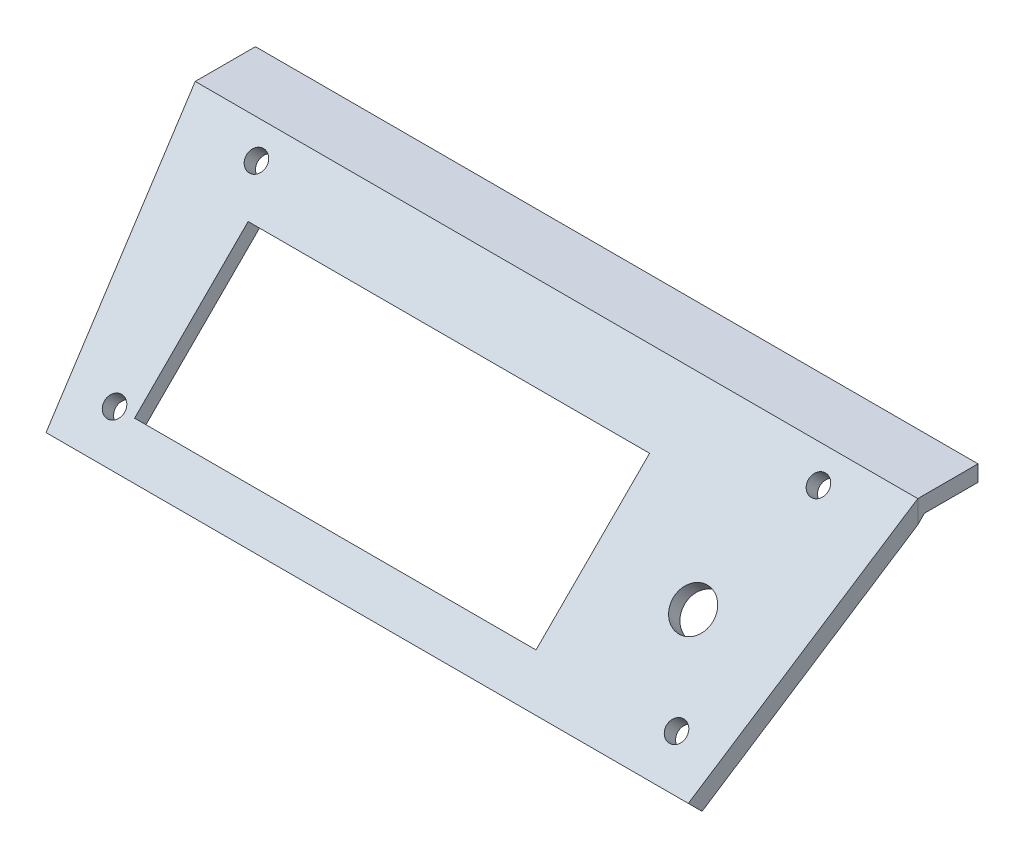
ISO-10303-21;
HEADER;
FILE_DESCRIPTION(('STEP AP214'),'2;1');
FILE_NAME('part.step','',(''),(''),'','','');
FILE_SCHEMA(('AUTOMOTIVE_DESIGN { 1 0 10303 214 1 1 1 1 }'));
ENDSEC;
DATA;
#1=APPLICATION_CONTEXT('core data for automotive mechanical design processes');
#2=APPLICATION_PROTOCOL_DEFINITION('international standard','automotive_design',2000,#1);
#3=PRODUCT_CONTEXT('',#1,'mechanical');
#4=PRODUCT('Part','Part','',(#3));
#5=PRODUCT_RELATED_PRODUCT_CATEGORY('part','',(#4));
#6=PRODUCT_DEFINITION_FORMATION('','',#4);
#7=PRODUCT_DEFINITION_CONTEXT('part definition',#1,'design');
#8=PRODUCT_DEFINITION('design','',#6,#7);
#9=PRODUCT_DEFINITION_SHAPE('','',#8);
#10=(LENGTH_UNIT() NAMED_UNIT(*) SI_UNIT(.MILLI.,.METRE.));
#11=(NAMED_UNIT(*) PLANE_ANGLE_UNIT() SI_UNIT($,.RADIAN.));
#12=(NAMED_UNIT(*) SI_UNIT($,.STERADIAN.) SOLID_ANGLE_UNIT());
#13=UNCERTAINTY_MEASURE_WITH_UNIT(LENGTH_MEASURE(1.E-05),#10,'distance_accuracy_value','');
#14=(GEOMETRIC_REPRESENTATION_CONTEXT(3) GLOBAL_UNCERTAINTY_ASSIGNED_CONTEXT((#13)) GLOBAL_UNIT_ASSIGNED_CONTEXT((#10,
#11,#12)) REPRESENTATION_CONTEXT('',''));
#15=CARTESIAN_POINT('',(0.,0.,0.));
#16=DIRECTION('',(0.,0.,1.));
#17=DIRECTION('',(1.,0.,0.));
#18=AXIS2_PLACEMENT_3D('',#15,#16,#17);
#19=CARTESIAN_POINT('',(90.,0.,59.3431457505075));
#20=DIRECTION('',(0.,0.707106781186546,0.707106781186549));
#21=DIRECTION('',(0.,-0.707106781186549,0.707106781186546));
#22=AXIS2_PLACEMENT_3D('',#19,#20,#21);
#23=PLANE('',#22);
#24=CARTESIAN_POINT('',(-70.,7.0710678118655,52.272077938642));
#25=DIRECTION('',(0.,0.707106781186546,0.707106781186549));
#26=DIRECTION('',(0.,-0.707106781186549,0.707106781186546));
#27=AXIS2_PLACEMENT_3D('',#24,#25,#26);
#28=CIRCLE('',#27,2.50000000000001);
#29=CARTESIAN_POINT('',(-70.,5.30330085889912,54.0398448916084));
#30=VERTEX_POINT('',#29);
#31=EDGE_CURVE('E399',#30,#30,#28,.F.);
#32=ORIENTED_EDGE('',*,*,#31,.F.);
#33=EDGE_LOOP('',(#32));
#34=FACE_BOUND('',#33,.T.);
#35=CARTESIAN_POINT('',(70.,42.426406871193,16.9167388793147));
#36=DIRECTION('',(0.,0.707106781186546,0.707106781186549));
#37=DIRECTION('',(0.,-0.707106781186549,0.707106781186546));
#38=AXIS2_PLACEMENT_3D('',#35,#36,#37);
#39=CIRCLE('',#38,2.5);
#40=CARTESIAN_POINT('',(70.,40.6586399182266,18.6845058322811));
#41=VERTEX_POINT('',#40);
#42=EDGE_CURVE('E408',#41,#41,#39,.T.);
#43=ORIENTED_EDGE('',*,*,#42,.T.);
#44=EDGE_LOOP('',(#43));
#45=FACE_BOUND('',#44,.T.);
#46=CARTESIAN_POINT('',(70.,7.0710678118655,52.272077938642));
#47=DIRECTION('',(0.,0.707106781186546,0.707106781186549));
#48=DIRECTION('',(0.,-0.707106781186549,0.707106781186546));
#49=AXIS2_PLACEMENT_3D('',#46,#47,#48);
#50=CIRCLE('',#49,2.50000000000001);
#51=CARTESIAN_POINT('',(70.,5.30330085889912,54.0398448916084));
#52=VERTEX_POINT('',#51);
#53=EDGE_CURVE('E414',#52,#52,#50,.T.);
#54=ORIENTED_EDGE('',*,*,#53,.T.);
#55=EDGE_LOOP('',(#54));
#56=FACE_BOUND('',#55,.T.);
#57=CARTESIAN_POINT('',(60.,21.2132034355965,38.1299423149111));
#58=DIRECTION('',(0.,0.707106781186546,0.707106781186549));
#59=DIRECTION('',(0.,-0.707106781186549,0.707106781186546));
#60=AXIS2_PLACEMENT_3D('',#57,#58,#59);
#61=CIRCLE('',#60,5.00000000000001);
#62=CARTESIAN_POINT('',(60.,17.6776695296637,41.6654762208438));
#63=VERTEX_POINT('',#62);
#64=EDGE_CURVE('E420',#63,#63,#61,.T.);
#65=ORIENTED_EDGE('',*,*,#64,.T.);
#66=EDGE_LOOP('',(#65));
#67=FACE_BOUND('',#66,.T.);
#68=DIRECTION('',(-1.,0.,0.));
#69=VECTOR('',#68,1.);
#70=CARTESIAN_POINT('',(90.,35.3553390593275,23.9878066911801));
#71=LINE('',#70,#69);
#72=CARTESIAN_POINT('',(35.,35.3553390593275,23.9878066911801));
#73=VERTEX_POINT('',#72);
#74=CARTESIAN_POINT('',(-65.,35.3553390593275,23.9878066911802));
#75=VERTEX_POINT('',#74);
#76=EDGE_CURVE('E145',#73,#75,#71,.T.);
#77=ORIENTED_EDGE('',*,*,#76,.T.);
#78=DIRECTION('',(0.,-0.707106781186549,0.707106781186546));
#79=VECTOR('',#78,1.);
#80=CARTESIAN_POINT('',(-65.,0.,59.3431457505075));
#81=LINE('',#80,#79);
#82=CARTESIAN_POINT('',(-65.,7.07106781186549,52.272077938642));
#83=VERTEX_POINT('',#82);
#84=EDGE_CURVE('E148',#75,#83,#81,.T.);
#85=ORIENTED_EDGE('',*,*,#84,.T.);
#86=DIRECTION('',(1.,0.,0.));
#87=VECTOR('',#86,1.);
#88=CARTESIAN_POINT('',(90.,7.07106781186551,52.272077938642));
#89=LINE('',#88,#87);
#90=CARTESIAN_POINT('',(35.,7.0710678118655,52.272077938642));
#91=VERTEX_POINT('',#90);
#92=EDGE_CURVE('E140',#83,#91,#89,.T.);
#93=ORIENTED_EDGE('',*,*,#92,.T.);
#94=DIRECTION('',(0.,0.707106781186549,-0.707106781186546));
#95=VECTOR('',#94,1.);
#96=CARTESIAN_POINT('',(35.,0.,59.3431457505075));
#97=LINE('',#96,#95);
#98=EDGE_CURVE('E120',#91,#73,#97,.T.);
#99=ORIENTED_EDGE('',*,*,#98,.T.);
#100=EDGE_LOOP('',(#77,#85,#93,#99));
#101=FACE_BOUND('',#100,.T.);
#102=DIRECTION('',(0.148244738794834,-0.699293749943347,0.699293749943344));
#103=VECTOR('',#102,1.);
#104=CARTESIAN_POINT('',(-76.8504215172653,-17.6854842172112,77.0286299677186));
#105=LINE('',#104,#103);
#106=CARTESIAN_POINT('',(-90.,44.3431457505076,15.));
#107=VERTEX_POINT('',#106);
#108=CARTESIAN_POINT('',(-80.5996041582556,0.,59.3431457505075));
#109=VERTEX_POINT('',#108);
#110=EDGE_CURVE('E155',#107,#109,#105,.T.);
#111=ORIENTED_EDGE('',*,*,#110,.F.);
#112=DIRECTION('',(0.,0.707106781186549,-0.707106781186546));
#113=VECTOR('',#112,1.);
#114=CARTESIAN_POINT('',(-90.,0.,59.3431457505075));
#115=LINE('',#114,#113);
#116=CARTESIAN_POINT('',(-90.,46.,13.3431457505077));
#117=VERTEX_POINT('',#116);
#118=EDGE_CURVE('E163',#107,#117,#115,.T.);
#119=ORIENTED_EDGE('',*,*,#118,.T.);
#120=DIRECTION('',(-1.,0.,0.));
#121=VECTOR('',#120,1.);
#122=CARTESIAN_POINT('',(90.,46.,13.3431457505077));
#123=LINE('',#122,#121);
#124=CARTESIAN_POINT('',(90.,46.,13.3431457505077));
#125=VERTEX_POINT('',#124);
#126=EDGE_CURVE('E193',#125,#117,#123,.T.);
#127=ORIENTED_EDGE('',*,*,#126,.F.);
#128=DIRECTION('',(0.,0.707106781186549,-0.707106781186546));
#129=VECTOR('',#128,1.);
#130=CARTESIAN_POINT('',(90.,0.,59.3431457505075));
#131=LINE('',#130,#129);
#132=CARTESIAN_POINT('',(90.,44.3431457505077,15.));
#133=VERTEX_POINT('',#132);
#134=EDGE_CURVE('E164',#133,#125,#131,.T.);
#135=ORIENTED_EDGE('',*,*,#134,.F.);
#136=DIRECTION('',(0.148244738794834,0.699293749943347,-0.699293749943344));
#137=VECTOR('',#136,1.);
#138=CARTESIAN_POINT('',(80.806191981728,0.974507257006798,58.3686384935007));
#139=LINE('',#138,#137);
#140=CARTESIAN_POINT('',(80.5996041582557,0.,59.3431457505075));
#141=VERTEX_POINT('',#140);
#142=EDGE_CURVE('E161',#141,#133,#139,.T.);
#143=ORIENTED_EDGE('',*,*,#142,.F.);
#144=DIRECTION('',(-1.,0.,0.));
#145=VECTOR('',#144,1.);
#146=CARTESIAN_POINT('',(90.,0.,59.3431457505075));
#147=LINE('',#146,#145);
#148=EDGE_CURVE('E196',#141,#109,#147,.T.);
#149=ORIENTED_EDGE('',*,*,#148,.T.);
#150=EDGE_LOOP('',(#111,#119,#127,#135,#143,#149));
#151=FACE_BOUND('',#150,.T.);
#152=CARTESIAN_POINT('',(-70.,42.426406871193,16.9167388793147));
#153=DIRECTION('',(0.,0.707106781186546,0.707106781186549));
#154=DIRECTION('',(0.,-0.707106781186549,0.707106781186546));
#155=AXIS2_PLACEMENT_3D('',#152,#153,#154);
#156=CIRCLE('',#155,2.5);
#157=CARTESIAN_POINT('',(-70.,40.6586399182266,18.6845058322811));
#158=VERTEX_POINT('',#157);
#159=EDGE_CURVE('E395',#158,#158,#156,.F.);
#160=ORIENTED_EDGE('',*,*,#159,.F.);
#161=EDGE_LOOP('',(#160));
#162=FACE_BOUND('',#161,.T.);
#163=ADVANCED_FACE('F32',(#34,#45,#56,#67,#101,#151,#162),#23,.F.);
#164=CARTESIAN_POINT('',(90.,50.,15.));
#165=DIRECTION('',(0.,-0.707106781186546,-0.707106781186548));
#166=DIRECTION('',(0.,0.707106781186549,-0.707106781186547));
#167=AXIS2_PLACEMENT_3D('',#164,#165,#166);
#168=PLANE('',#167);
#169=CARTESIAN_POINT('',(-70.,9.8994949366117,55.1005050633882));
#170=DIRECTION('',(0.,-0.707106781186547,-0.707106781186548));
#171=DIRECTION('',(0.,-0.707106781186548,0.707106781186547));
#172=AXIS2_PLACEMENT_3D('',#169,#170,#171);
#173=CIRCLE('',#172,2.50000000000001);
#174=CARTESIAN_POINT('',(-70.,8.13172798364532,56.8682720163546));
#175=VERTEX_POINT('',#174);
#176=EDGE_CURVE('E396',#175,#175,#173,.T.);
#177=ORIENTED_EDGE('',*,*,#176,.T.);
#178=EDGE_LOOP('',(#177));
#179=FACE_BOUND('',#178,.T.);
#180=CARTESIAN_POINT('',(70.,45.2548339959391,19.7451660040609));
#181=DIRECTION('',(0.,0.707106781186547,0.707106781186548));
#182=DIRECTION('',(0.,-0.707106781186548,0.707106781186547));
#183=AXIS2_PLACEMENT_3D('',#180,#181,#182);
#184=CIRCLE('',#183,2.5);
#185=CARTESIAN_POINT('',(70.,43.4870670429728,21.5129329570272));
#186=VERTEX_POINT('',#185);
#187=EDGE_CURVE('E405',#186,#186,#184,.T.);
#188=ORIENTED_EDGE('',*,*,#187,.F.);
#189=EDGE_LOOP('',(#188));
#190=FACE_BOUND('',#189,.T.);
#191=CARTESIAN_POINT('',(70.,9.8994949366117,55.1005050633882));
#192=DIRECTION('',(0.,0.707106781186547,0.707106781186548));
#193=DIRECTION('',(0.,-0.707106781186548,0.707106781186547));
#194=AXIS2_PLACEMENT_3D('',#191,#192,#193);
#195=CIRCLE('',#194,2.50000000000001);
#196=CARTESIAN_POINT('',(70.,8.13172798364532,56.8682720163546));
#197=VERTEX_POINT('',#196);
#198=EDGE_CURVE('E411',#197,#197,#195,.T.);
#199=ORIENTED_EDGE('',*,*,#198,.F.);
#200=EDGE_LOOP('',(#199));
#201=FACE_BOUND('',#200,.T.);
#202=CARTESIAN_POINT('',(60.,24.0416305603427,40.9583694396573));
#203=DIRECTION('',(0.,0.707106781186547,0.707106781186548));
#204=DIRECTION('',(0.,-0.707106781186548,0.707106781186547));
#205=AXIS2_PLACEMENT_3D('',#202,#203,#204);
#206=CIRCLE('',#205,5.00000000000001);
#207=CARTESIAN_POINT('',(60.,20.5060966544099,44.49390334559));
#208=VERTEX_POINT('',#207);
#209=EDGE_CURVE('E417',#208,#208,#206,.T.);
#210=ORIENTED_EDGE('',*,*,#209,.F.);
#211=EDGE_LOOP('',(#210));
#212=FACE_BOUND('',#211,.T.);
#213=DIRECTION('',(1.,0.,0.));
#214=VECTOR('',#213,1.);
#215=CARTESIAN_POINT('',(35.,9.89949493661171,55.1005050633882));
#216=LINE('',#215,#214);
#217=CARTESIAN_POINT('',(-65.,9.89949493661168,55.1005050633882));
#218=VERTEX_POINT('',#217);
#219=CARTESIAN_POINT('',(35.,9.89949493661171,55.1005050633882));
#220=VERTEX_POINT('',#219);
#221=EDGE_CURVE('E126',#218,#220,#216,.T.);
#222=ORIENTED_EDGE('',*,*,#221,.F.);
#223=DIRECTION('',(0.,-0.707106781186548,0.707106781186547));
#224=VECTOR('',#223,1.);
#225=CARTESIAN_POINT('',(-65.,9.8994949366117,55.1005050633882));
#226=LINE('',#225,#224);
#227=CARTESIAN_POINT('',(-65.,38.1837661840736,26.8162338159264));
#228=VERTEX_POINT('',#227);
#229=EDGE_CURVE('E55',#228,#218,#226,.T.);
#230=ORIENTED_EDGE('',*,*,#229,.F.);
#231=DIRECTION('',(-1.,0.,0.));
#232=VECTOR('',#231,1.);
#233=CARTESIAN_POINT('',(35.,38.1837661840736,26.8162338159263));
#234=LINE('',#233,#232);
#235=CARTESIAN_POINT('',(35.,38.1837661840736,26.8162338159263));
#236=VERTEX_POINT('',#235);
#237=EDGE_CURVE('E133',#236,#228,#234,.T.);
#238=ORIENTED_EDGE('',*,*,#237,.F.);
#239=DIRECTION('',(0.,0.707106781186548,-0.707106781186547));
#240=VECTOR('',#239,1.);
#241=CARTESIAN_POINT('',(35.,9.89949493661171,55.1005050633882));
#242=LINE('',#241,#240);
#243=EDGE_CURVE('E117',#220,#236,#242,.T.);
#244=ORIENTED_EDGE('',*,*,#243,.F.);
#245=EDGE_LOOP('',(#222,#230,#238,#244));
#246=FACE_BOUND('',#245,.T.);
#247=DIRECTION('',(-0.148244738794834,0.699293749943346,-0.699293749943344));
#248=VECTOR('',#247,1.);
#249=CARTESIAN_POINT('',(-86.0442295355373,31.340008525782,33.6599914742179));
#250=LINE('',#249,#248);
#251=CARTESIAN_POINT('',(-80.,2.82842712474614,62.1715728752537));
#252=VERTEX_POINT('',#251);
#253=CARTESIAN_POINT('',(-90.,50.,15.));
#254=VERTEX_POINT('',#253);
#255=EDGE_CURVE('E151',#252,#254,#250,.T.);
#256=ORIENTED_EDGE('',*,*,#255,.F.);
#257=DIRECTION('',(-1.,0.,0.));
#258=VECTOR('',#257,1.);
#259=CARTESIAN_POINT('',(90.,2.82842712474618,62.1715728752537));
#260=LINE('',#259,#258);
#261=CARTESIAN_POINT('',(80.,2.82842712474621,62.1715728752537));
#262=VERTEX_POINT('',#261);
#263=EDGE_CURVE('E174',#262,#252,#260,.T.);
#264=ORIENTED_EDGE('',*,*,#263,.F.);
#265=DIRECTION('',(-0.148244738794834,-0.699293749943346,0.699293749943344));
#266=VECTOR('',#265,1.);
#267=CARTESIAN_POINT('',(90.,50.,15.));
#268=LINE('',#267,#266);
#269=CARTESIAN_POINT('',(90.,50.,15.));
#270=VERTEX_POINT('',#269);
#271=EDGE_CURVE('E157',#270,#262,#268,.T.);
#272=ORIENTED_EDGE('',*,*,#271,.F.);
#273=DIRECTION('',(-1.,0.,0.));
#274=VECTOR('',#273,1.);
#275=CARTESIAN_POINT('',(90.,50.,15.));
#276=LINE('',#275,#274);
#277=EDGE_CURVE('E184',#270,#254,#276,.T.);
#278=ORIENTED_EDGE('',*,*,#277,.T.);
#279=EDGE_LOOP('',(#256,#264,#272,#278));
#280=FACE_BOUND('',#279,.T.);
#281=CARTESIAN_POINT('',(-70.,45.2548339959391,19.7451660040609));
#282=DIRECTION('',(0.,-0.707106781186547,-0.707106781186548));
#283=DIRECTION('',(0.,-0.707106781186548,0.707106781186547));
#284=AXIS2_PLACEMENT_3D('',#281,#282,#283);
#285=CIRCLE('',#284,2.5);
#286=CARTESIAN_POINT('',(-70.,43.4870670429728,21.5129329570272));
#287=VERTEX_POINT('',#286);
#288=EDGE_CURVE('E392',#287,#287,#285,.T.);
#289=ORIENTED_EDGE('',*,*,#288,.T.);
#290=EDGE_LOOP('',(#289));
#291=FACE_BOUND('',#290,.T.);
#292=ADVANCED_FACE('F130',(#179,#190,#201,#212,#246,#280,#291),#168,.F.);
#293=CARTESIAN_POINT('',(90.,2.82842712474618,62.1715728752537));
#294=DIRECTION('',(0.,0.707106781186549,-0.707106781186545));
#295=DIRECTION('',(0.,0.707106781186546,0.70710678118655));
#296=AXIS2_PLACEMENT_3D('',#293,#294,#295);
#297=PLANE('',#296);
#298=DIRECTION('',(0.148244738794834,0.699293749943343,0.699293749943347));
#299=VECTOR('',#298,1.);
#300=CARTESIAN_POINT('',(-76.2639945613407,20.4517524059521,79.7948981564597));
#301=LINE('',#300,#299);
#302=EDGE_CURVE('E153',#109,#252,#301,.T.);
#303=ORIENTED_EDGE('',*,*,#302,.F.);
#304=ORIENTED_EDGE('',*,*,#148,.F.);
#305=DIRECTION('',(0.148244738794834,-0.699293749943343,-0.699293749943347));
#306=VECTOR('',#305,1.);
#307=CARTESIAN_POINT('',(80.2197650258035,1.79176093173407,61.1349066822416));
#308=LINE('',#307,#306);
#309=EDGE_CURVE('E159',#262,#141,#308,.T.);
#310=ORIENTED_EDGE('',*,*,#309,.F.);
#311=ORIENTED_EDGE('',*,*,#263,.T.);
#312=EDGE_LOOP('',(#303,#304,#310,#311));
#313=FACE_BOUND('',#312,.T.);
#314=ADVANCED_FACE('F34',(#313),#297,.F.);
#315=CARTESIAN_POINT('',(-90.,0.,0.));
#316=DIRECTION('',(1.,0.,0.));
#317=DIRECTION('',(0.,0.,-1.));
#318=AXIS2_PLACEMENT_3D('',#315,#316,#317);
#319=PLANE('',#318);
#320=DIRECTION('',(0.,-1.,0.));
#321=VECTOR('',#320,1.);
#322=CARTESIAN_POINT('',(-90.,0.,15.));
#323=LINE('',#322,#321);
#324=EDGE_CURVE('E11',#254,#107,#323,.T.);
#325=ORIENTED_EDGE('',*,*,#324,.F.);
#326=DIRECTION('',(0.,0.,1.));
#327=VECTOR('',#326,1.);
#328=CARTESIAN_POINT('',(-90.,50.,0.));
#329=LINE('',#328,#327);
#330=CARTESIAN_POINT('',(-90.,50.,0.));
#331=VERTEX_POINT('',#330);
#332=EDGE_CURVE('E167',#331,#254,#329,.T.);
#333=ORIENTED_EDGE('',*,*,#332,.F.);
#334=DIRECTION('',(0.,1.,0.));
#335=VECTOR('',#334,1.);
#336=CARTESIAN_POINT('',(-90.,46.,0.));
#337=LINE('',#336,#335);
#338=CARTESIAN_POINT('',(-90.,46.,0.));
#339=VERTEX_POINT('',#338);
#340=EDGE_CURVE('E178',#339,#331,#337,.T.);
#341=ORIENTED_EDGE('',*,*,#340,.F.);
#342=DIRECTION('',(0.,0.,-1.));
#343=VECTOR('',#342,1.);
#344=CARTESIAN_POINT('',(-90.,46.,13.3431457505077));
#345=LINE('',#344,#343);
#346=EDGE_CURVE('E176',#117,#339,#345,.T.);
#347=ORIENTED_EDGE('',*,*,#346,.F.);
#348=ORIENTED_EDGE('',*,*,#118,.F.);
#349=EDGE_LOOP('',(#325,#333,#341,#347,#348));
#350=FACE_BOUND('',#349,.T.);
#351=ADVANCED_FACE('F236',(#350),#319,.F.);
#352=CARTESIAN_POINT('',(90.,0.,0.));
#353=DIRECTION('',(1.,0.,0.));
#354=DIRECTION('',(0.,0.,-1.));
#355=AXIS2_PLACEMENT_3D('',#352,#353,#354);
#356=PLANE('',#355);
#357=DIRECTION('',(0.,0.,1.));
#358=VECTOR('',#357,1.);
#359=CARTESIAN_POINT('',(90.,50.,0.));
#360=LINE('',#359,#358);
#361=CARTESIAN_POINT('',(90.,50.,0.));
#362=VERTEX_POINT('',#361);
#363=EDGE_CURVE('E171',#362,#270,#360,.T.);
#364=ORIENTED_EDGE('',*,*,#363,.T.);
#365=DIRECTION('',(0.,-1.,0.));
#366=VECTOR('',#365,1.);
#367=CARTESIAN_POINT('',(90.,0.,15.));
#368=LINE('',#367,#366);
#369=EDGE_CURVE('E40',#270,#133,#368,.T.);
#370=ORIENTED_EDGE('',*,*,#369,.T.);
#371=ORIENTED_EDGE('',*,*,#134,.T.);
#372=DIRECTION('',(0.,0.,-1.));
#373=VECTOR('',#372,1.);
#374=CARTESIAN_POINT('',(90.,46.,13.3431457505077));
#375=LINE('',#374,#373);
#376=CARTESIAN_POINT('',(90.,46.,0.));
#377=VERTEX_POINT('',#376);
#378=EDGE_CURVE('E166',#125,#377,#375,.T.);
#379=ORIENTED_EDGE('',*,*,#378,.T.);
#380=DIRECTION('',(0.,1.,0.));
#381=VECTOR('',#380,1.);
#382=CARTESIAN_POINT('',(90.,46.,0.));
#383=LINE('',#382,#381);
#384=EDGE_CURVE('E169',#377,#362,#383,.T.);
#385=ORIENTED_EDGE('',*,*,#384,.T.);
#386=EDGE_LOOP('',(#364,#370,#371,#379,#385));
#387=FACE_BOUND('',#386,.T.);
#388=ADVANCED_FACE('F201',(#387),#356,.T.);
#389=CARTESIAN_POINT('',(90.,46.,13.3431457505077));
#390=DIRECTION('',(0.,1.,0.));
#391=DIRECTION('',(0.,0.,1.));
#392=AXIS2_PLACEMENT_3D('',#389,#390,#391);
#393=PLANE('',#392);
#394=ORIENTED_EDGE('',*,*,#346,.T.);
#395=DIRECTION('',(-1.,0.,0.));
#396=VECTOR('',#395,1.);
#397=CARTESIAN_POINT('',(90.,46.,0.));
#398=LINE('',#397,#396);
#399=EDGE_CURVE('E190',#377,#339,#398,.T.);
#400=ORIENTED_EDGE('',*,*,#399,.F.);
#401=ORIENTED_EDGE('',*,*,#378,.F.);
#402=ORIENTED_EDGE('',*,*,#126,.T.);
#403=EDGE_LOOP('',(#394,#400,#401,#402));
#404=FACE_BOUND('',#403,.T.);
#405=ADVANCED_FACE('F217',(#404),#393,.F.);
#406=CARTESIAN_POINT('',(90.,46.,0.));
#407=DIRECTION('',(0.,0.,1.));
#408=DIRECTION('',(1.,0.,0.));
#409=AXIS2_PLACEMENT_3D('',#406,#407,#408);
#410=PLANE('',#409);
#411=ORIENTED_EDGE('',*,*,#340,.T.);
#412=DIRECTION('',(-1.,0.,0.));
#413=VECTOR('',#412,1.);
#414=CARTESIAN_POINT('',(90.,50.,0.));
#415=LINE('',#414,#413);
#416=EDGE_CURVE('E187',#362,#331,#415,.T.);
#417=ORIENTED_EDGE('',*,*,#416,.F.);
#418=ORIENTED_EDGE('',*,*,#384,.F.);
#419=ORIENTED_EDGE('',*,*,#399,.T.);
#420=EDGE_LOOP('',(#411,#417,#418,#419));
#421=FACE_BOUND('',#420,.T.);
#422=ADVANCED_FACE('F221',(#421),#410,.F.);
#423=CARTESIAN_POINT('',(90.,50.,0.));
#424=DIRECTION('',(0.,-1.,0.));
#425=DIRECTION('',(0.,0.,-1.));
#426=AXIS2_PLACEMENT_3D('',#423,#424,#425);
#427=PLANE('',#426);
#428=ORIENTED_EDGE('',*,*,#332,.T.);
#429=ORIENTED_EDGE('',*,*,#277,.F.);
#430=ORIENTED_EDGE('',*,*,#363,.F.);
#431=ORIENTED_EDGE('',*,*,#416,.T.);
#432=EDGE_LOOP('',(#428,#429,#430,#431));
#433=FACE_BOUND('',#432,.T.);
#434=ADVANCED_FACE('F225',(#433),#427,.F.);
#435=CARTESIAN_POINT('',(90.,160.,15.));
#436=DIRECTION('',(0.978259759376829,0.,0.207383324266897));
#437=DIRECTION('',(0.207383324266897,0.,-0.978259759376829));
#438=AXIS2_PLACEMENT_3D('',#435,#436,#437);
#439=PLANE('',#438);
#440=ORIENTED_EDGE('',*,*,#142,.T.);
#441=ORIENTED_EDGE('',*,*,#369,.F.);
#442=ORIENTED_EDGE('',*,*,#271,.T.);
#443=ORIENTED_EDGE('',*,*,#309,.T.);
#444=EDGE_LOOP('',(#440,#441,#442,#443));
#445=FACE_BOUND('',#444,.T.);
#446=ADVANCED_FACE('F230',(#445),#439,.T.);
#447=CARTESIAN_POINT('',(-80.,160.,62.1715728752537));
#448=DIRECTION('',(-0.978259759376829,0.,0.207383324266897));
#449=DIRECTION('',(0.207383324266897,0.,0.978259759376829));
#450=AXIS2_PLACEMENT_3D('',#447,#448,#449);
#451=PLANE('',#450);
#452=ORIENTED_EDGE('',*,*,#110,.T.);
#453=ORIENTED_EDGE('',*,*,#302,.T.);
#454=ORIENTED_EDGE('',*,*,#255,.T.);
#455=ORIENTED_EDGE('',*,*,#324,.T.);
#456=EDGE_LOOP('',(#452,#453,#454,#455));
#457=FACE_BOUND('',#456,.T.);
#458=ADVANCED_FACE('F237',(#457),#451,.T.);
#459=CARTESIAN_POINT('',(-65.,-22.6005050633883,22.6005050633882));
#460=DIRECTION('',(-1.,0.,0.));
#461=DIRECTION('',(0.,0.,1.));
#462=AXIS2_PLACEMENT_3D('',#459,#460,#461);
#463=PLANE('',#462);
#464=DIRECTION('',(0.,0.707106781186547,0.707106781186548));
#465=VECTOR('',#464,1.);
#466=CARTESIAN_POINT('',(-65.,5.68376618407369,-5.68376618407368));
#467=LINE('',#466,#465);
#468=EDGE_CURVE('E138',#75,#228,#467,.T.);
#469=ORIENTED_EDGE('',*,*,#468,.T.);
#470=ORIENTED_EDGE('',*,*,#229,.T.);
#471=DIRECTION('',(0.,0.707106781186547,0.707106781186548));
#472=VECTOR('',#471,1.);
#473=CARTESIAN_POINT('',(-65.,-22.6005050633883,22.6005050633882));
#474=LINE('',#473,#472);
#475=EDGE_CURVE('E123',#83,#218,#474,.T.);
#476=ORIENTED_EDGE('',*,*,#475,.F.);
#477=ORIENTED_EDGE('',*,*,#84,.F.);
#478=EDGE_LOOP('',(#469,#470,#476,#477));
#479=FACE_BOUND('',#478,.T.);
#480=ADVANCED_FACE('F239',(#479),#463,.F.);
#481=CARTESIAN_POINT('',(35.,5.68376618407369,-5.68376618407369));
#482=DIRECTION('',(0.,0.707106781186548,-0.707106781186547));
#483=DIRECTION('',(0.,0.707106781186547,0.707106781186548));
#484=AXIS2_PLACEMENT_3D('',#481,#482,#483);
#485=PLANE('',#484);
#486=DIRECTION('',(0.,0.707106781186547,0.707106781186548));
#487=VECTOR('',#486,1.);
#488=CARTESIAN_POINT('',(35.,5.68376618407369,-5.68376618407369));
#489=LINE('',#488,#487);
#490=EDGE_CURVE('E122',#73,#236,#489,.T.);
#491=ORIENTED_EDGE('',*,*,#490,.T.);
#492=ORIENTED_EDGE('',*,*,#237,.T.);
#493=ORIENTED_EDGE('',*,*,#468,.F.);
#494=ORIENTED_EDGE('',*,*,#76,.F.);
#495=EDGE_LOOP('',(#491,#492,#493,#494));
#496=FACE_BOUND('',#495,.T.);
#497=ADVANCED_FACE('F245',(#496),#485,.F.);
#498=CARTESIAN_POINT('',(35.,-22.6005050633882,22.6005050633882));
#499=DIRECTION('',(1.,0.,0.));
#500=DIRECTION('',(0.,0.,-1.));
#501=AXIS2_PLACEMENT_3D('',#498,#499,#500);
#502=PLANE('',#501);
#503=DIRECTION('',(0.,0.707106781186547,0.707106781186548));
#504=VECTOR('',#503,1.);
#505=CARTESIAN_POINT('',(35.,-22.6005050633882,22.6005050633882));
#506=LINE('',#505,#504);
#507=EDGE_CURVE('E47',#91,#220,#506,.T.);
#508=ORIENTED_EDGE('',*,*,#507,.T.);
#509=ORIENTED_EDGE('',*,*,#243,.T.);
#510=ORIENTED_EDGE('',*,*,#490,.F.);
#511=ORIENTED_EDGE('',*,*,#98,.F.);
#512=EDGE_LOOP('',(#508,#509,#510,#511));
#513=FACE_BOUND('',#512,.T.);
#514=ADVANCED_FACE('F114',(#513),#502,.F.);
#515=CARTESIAN_POINT('',(35.,-22.6005050633882,22.6005050633882));
#516=DIRECTION('',(0.,-0.707106781186548,0.707106781186547));
#517=DIRECTION('',(0.,-0.707106781186547,-0.707106781186548));
#518=AXIS2_PLACEMENT_3D('',#515,#516,#517);
#519=PLANE('',#518);
#520=ORIENTED_EDGE('',*,*,#475,.T.);
#521=ORIENTED_EDGE('',*,*,#221,.T.);
#522=ORIENTED_EDGE('',*,*,#507,.F.);
#523=ORIENTED_EDGE('',*,*,#92,.F.);
#524=EDGE_LOOP('',(#520,#521,#522,#523));
#525=FACE_BOUND('',#524,.T.);
#526=ADVANCED_FACE('F127',(#525),#519,.F.);
#527=CARTESIAN_POINT('',(60.,-8.45836943965728,8.45836943965724));
#528=DIRECTION('',(0.,0.707106781186547,0.707106781186548));
#529=DIRECTION('',(0.,-0.707106781186548,0.707106781186547));
#530=AXIS2_PLACEMENT_3D('',#527,#528,#529);
#531=CYLINDRICAL_SURFACE('',#530,5.00000000000001);
#532=ORIENTED_EDGE('',*,*,#209,.T.);
#533=EDGE_LOOP('',(#532));
#534=FACE_BOUND('',#533,.T.);
#535=ORIENTED_EDGE('',*,*,#64,.F.);
#536=EDGE_LOOP('',(#535));
#537=FACE_BOUND('',#536,.T.);
#538=ADVANCED_FACE('F326',(#534,#537),#531,.F.);
#539=CARTESIAN_POINT('',(70.,-22.6005050633883,22.6005050633882));
#540=DIRECTION('',(0.,0.707106781186547,0.707106781186548));
#541=DIRECTION('',(0.,-0.707106781186548,0.707106781186547));
#542=AXIS2_PLACEMENT_3D('',#539,#540,#541);
#543=CYLINDRICAL_SURFACE('',#542,2.50000000000001);
#544=ORIENTED_EDGE('',*,*,#198,.T.);
#545=EDGE_LOOP('',(#544));
#546=FACE_BOUND('',#545,.T.);
#547=ORIENTED_EDGE('',*,*,#53,.F.);
#548=EDGE_LOOP('',(#547));
#549=FACE_BOUND('',#548,.T.);
#550=ADVANCED_FACE('F335',(#546,#549),#543,.F.);
#551=CARTESIAN_POINT('',(70.,12.7548339959392,-12.7548339959392));
#552=DIRECTION('',(0.,0.707106781186547,0.707106781186548));
#553=DIRECTION('',(0.,-0.707106781186548,0.707106781186547));
#554=AXIS2_PLACEMENT_3D('',#551,#552,#553);
#555=CYLINDRICAL_SURFACE('',#554,2.5);
#556=ORIENTED_EDGE('',*,*,#187,.T.);
#557=EDGE_LOOP('',(#556));
#558=FACE_BOUND('',#557,.T.);
#559=ORIENTED_EDGE('',*,*,#42,.F.);
#560=EDGE_LOOP('',(#559));
#561=FACE_BOUND('',#560,.T.);
#562=ADVANCED_FACE('F345',(#558,#561),#555,.F.);
#563=CARTESIAN_POINT('',(-70.,-22.6005050633883,22.6005050633882));
#564=DIRECTION('',(0.,0.707106781186547,0.707106781186548));
#565=DIRECTION('',(0.,-0.707106781186548,0.707106781186547));
#566=AXIS2_PLACEMENT_3D('',#563,#564,#565);
#567=CYLINDRICAL_SURFACE('',#566,2.50000000000001);
#568=ORIENTED_EDGE('',*,*,#176,.F.);
#569=EDGE_LOOP('',(#568));
#570=FACE_BOUND('',#569,.T.);
#571=ORIENTED_EDGE('',*,*,#31,.T.);
#572=EDGE_LOOP('',(#571));
#573=FACE_BOUND('',#572,.T.);
#574=ADVANCED_FACE('F354',(#570,#573),#567,.F.);
#575=CARTESIAN_POINT('',(-70.,12.7548339959392,-12.7548339959392));
#576=DIRECTION('',(0.,0.707106781186547,0.707106781186548));
#577=DIRECTION('',(0.,-0.707106781186548,0.707106781186547));
#578=AXIS2_PLACEMENT_3D('',#575,#576,#577);
#579=CYLINDRICAL_SURFACE('',#578,2.5);
#580=ORIENTED_EDGE('',*,*,#288,.F.);
#581=EDGE_LOOP('',(#580));
#582=FACE_BOUND('',#581,.T.);
#583=ORIENTED_EDGE('',*,*,#159,.T.);
#584=EDGE_LOOP('',(#583));
#585=FACE_BOUND('',#584,.T.);
#586=ADVANCED_FACE('F375',(#582,#585),#579,.F.);
#587=CLOSED_SHELL('',(#163,#292,#314,#351,#388,#405,#422,#434,#446,#458,#480,#497,#514,#526,
#538,#550,#562,#574,#586));
#588=MANIFOLD_SOLID_BREP('B2',#587);
#589=ADVANCED_BREP_SHAPE_REPRESENTATION('',(#18,#588),#14);
#590=SHAPE_DEFINITION_REPRESENTATION(#9,#589);
ENDSEC;
END-ISO-10303-21;
